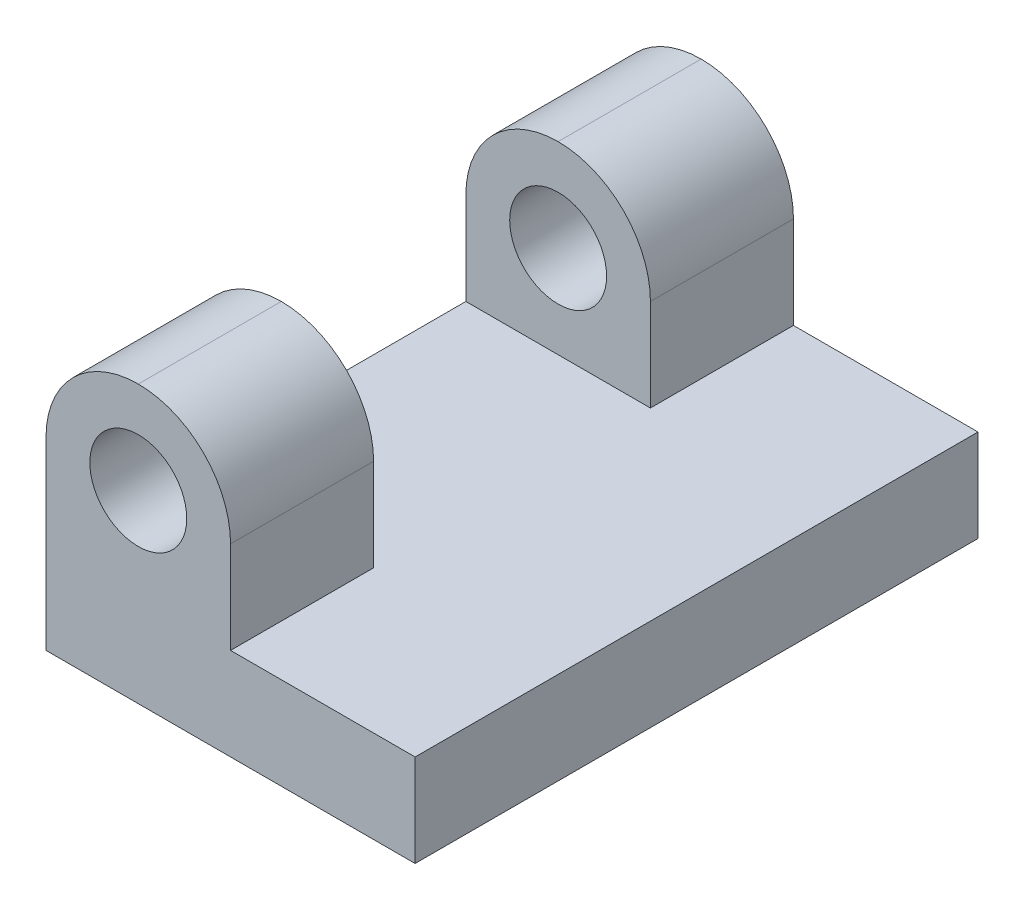
ISO-10303-21;
HEADER;
FILE_DESCRIPTION(('STEP AP214'),'2;1');
FILE_NAME('part.step','',(''),(''),'','','');
FILE_SCHEMA(('AUTOMOTIVE_DESIGN { 1 0 10303 214 1 1 1 1 }'));
ENDSEC;
DATA;
#1=APPLICATION_CONTEXT('core data for automotive mechanical design processes');
#2=APPLICATION_PROTOCOL_DEFINITION('international standard','automotive_design',2000,#1);
#3=PRODUCT_CONTEXT('',#1,'mechanical');
#4=PRODUCT('Part','Part','',(#3));
#5=PRODUCT_RELATED_PRODUCT_CATEGORY('part','',(#4));
#6=PRODUCT_DEFINITION_FORMATION('','',#4);
#7=PRODUCT_DEFINITION_CONTEXT('part definition',#1,'design');
#8=PRODUCT_DEFINITION('design','',#6,#7);
#9=PRODUCT_DEFINITION_SHAPE('','',#8);
#10=(LENGTH_UNIT() NAMED_UNIT(*) SI_UNIT(.MILLI.,.METRE.));
#11=(NAMED_UNIT(*) PLANE_ANGLE_UNIT() SI_UNIT($,.RADIAN.));
#12=(NAMED_UNIT(*) SI_UNIT($,.STERADIAN.) SOLID_ANGLE_UNIT());
#13=UNCERTAINTY_MEASURE_WITH_UNIT(LENGTH_MEASURE(1.E-05),#10,'distance_accuracy_value','');
#14=(GEOMETRIC_REPRESENTATION_CONTEXT(3) GLOBAL_UNCERTAINTY_ASSIGNED_CONTEXT((#13)) GLOBAL_UNIT_ASSIGNED_CONTEXT((#10,
#11,#12)) REPRESENTATION_CONTEXT('',''));
#15=CARTESIAN_POINT('',(0.,0.,0.));
#16=DIRECTION('',(0.,0.,1.));
#17=DIRECTION('',(1.,0.,0.));
#18=AXIS2_PLACEMENT_3D('',#15,#16,#17);
#19=CARTESIAN_POINT('',(0.,9.,-9.15));
#20=DIRECTION('',(-1.,0.,0.));
#21=DIRECTION('',(0.,0.,1.));
#22=AXIS2_PLACEMENT_3D('',#19,#20,#21);
#23=PLANE('',#22);
#24=DIRECTION('',(0.,1.,0.));
#25=VECTOR('',#24,1.);
#26=CARTESIAN_POINT('',(0.,-7.81665382639197,4.5));
#27=LINE('',#26,#25);
#28=CARTESIAN_POINT('',(0.,3.,4.5));
#29=VERTEX_POINT('',#28);
#30=CARTESIAN_POINT('',(0.,6.,4.5));
#31=VERTEX_POINT('',#30);
#32=EDGE_CURVE('E130',#29,#31,#27,.T.);
#33=ORIENTED_EDGE('',*,*,#32,.T.);
#34=DIRECTION('',(0.,0.,-1.));
#35=VECTOR('',#34,1.);
#36=CARTESIAN_POINT('',(0.,6.,9.15));
#37=LINE('',#36,#35);
#38=CARTESIAN_POINT('',(0.,6.,9.15));
#39=VERTEX_POINT('',#38);
#40=EDGE_CURVE('E242',#31,#39,#37,.F.);
#41=ORIENTED_EDGE('',*,*,#40,.T.);
#42=DIRECTION('',(0.,-1.,0.));
#43=VECTOR('',#42,1.);
#44=CARTESIAN_POINT('',(0.,9.,9.15));
#45=LINE('',#44,#43);
#46=CARTESIAN_POINT('',(0.,3.,9.15));
#47=VERTEX_POINT('',#46);
#48=EDGE_CURVE('E158',#39,#47,#45,.T.);
#49=ORIENTED_EDGE('',*,*,#48,.T.);
#50=DIRECTION('',(0.,0.,-1.));
#51=VECTOR('',#50,1.);
#52=CARTESIAN_POINT('',(0.,3.,-9.15));
#53=LINE('',#52,#51);
#54=EDGE_CURVE('E148',#47,#29,#53,.T.);
#55=ORIENTED_EDGE('',*,*,#54,.T.);
#56=EDGE_LOOP('',(#33,#41,#49,#55));
#57=FACE_BOUND('',#56,.T.);
#58=ADVANCED_FACE('F43',(#57),#23,.F.);
#59=CARTESIAN_POINT('',(-3.,6.,-9.15));
#60=DIRECTION('',(0.,0.,1.));
#61=DIRECTION('',(1.,0.,0.));
#62=AXIS2_PLACEMENT_3D('',#59,#60,#61);
#63=CYLINDRICAL_SURFACE('',#62,1.575);
#64=CARTESIAN_POINT('',(-3.,6.,4.5));
#65=DIRECTION('',(0.,0.,1.));
#66=DIRECTION('',(1.,0.,0.));
#67=AXIS2_PLACEMENT_3D('',#64,#65,#66);
#68=CIRCLE('',#67,1.575);
#69=CARTESIAN_POINT('',(-1.425,6.,4.5));
#70=VERTEX_POINT('',#69);
#71=EDGE_CURVE('E219',#70,#70,#68,.F.);
#72=ORIENTED_EDGE('',*,*,#71,.T.);
#73=EDGE_LOOP('',(#72));
#74=FACE_BOUND('',#73,.T.);
#75=CARTESIAN_POINT('',(-3.,6.,9.15));
#76=DIRECTION('',(0.,0.,1.));
#77=DIRECTION('',(1.,0.,0.));
#78=AXIS2_PLACEMENT_3D('',#75,#76,#77);
#79=CIRCLE('',#78,1.575);
#80=CARTESIAN_POINT('',(-1.425,6.,9.15));
#81=VERTEX_POINT('',#80);
#82=EDGE_CURVE('E169',#81,#81,#79,.T.);
#83=ORIENTED_EDGE('',*,*,#82,.T.);
#84=EDGE_LOOP('',(#83));
#85=FACE_BOUND('',#84,.T.);
#86=ADVANCED_FACE('F294',(#74,#85),#63,.F.);
#87=CARTESIAN_POINT('',(0.,3.,0.));
#88=DIRECTION('',(0.,-1.,0.));
#89=DIRECTION('',(0.,0.,-1.));
#90=AXIS2_PLACEMENT_3D('',#87,#88,#89);
#91=PLANE('',#90);
#92=ORIENTED_EDGE('',*,*,#54,.F.);
#93=DIRECTION('',(1.,0.,0.));
#94=VECTOR('',#93,1.);
#95=CARTESIAN_POINT('',(-6.,3.,9.15));
#96=LINE('',#95,#94);
#97=CARTESIAN_POINT('',(6.,3.,9.15));
#98=VERTEX_POINT('',#97);
#99=EDGE_CURVE('E184',#47,#98,#96,.T.);
#100=ORIENTED_EDGE('',*,*,#99,.T.);
#101=DIRECTION('',(0.,0.,-1.));
#102=VECTOR('',#101,1.);
#103=CARTESIAN_POINT('',(6.,3.,9.15));
#104=LINE('',#103,#102);
#105=CARTESIAN_POINT('',(6.,3.,-9.15));
#106=VERTEX_POINT('',#105);
#107=EDGE_CURVE('E175',#98,#106,#104,.T.);
#108=ORIENTED_EDGE('',*,*,#107,.T.);
#109=DIRECTION('',(-1.,0.,0.));
#110=VECTOR('',#109,1.);
#111=CARTESIAN_POINT('',(-6.,3.,-9.15));
#112=LINE('',#111,#110);
#113=CARTESIAN_POINT('',(0.,3.,-9.15));
#114=VERTEX_POINT('',#113);
#115=EDGE_CURVE('E179',#106,#114,#112,.T.);
#116=ORIENTED_EDGE('',*,*,#115,.T.);
#117=CARTESIAN_POINT('',(0.,3.,-4.5));
#118=VERTEX_POINT('',#117);
#119=EDGE_CURVE('E161',#118,#114,#53,.T.);
#120=ORIENTED_EDGE('',*,*,#119,.F.);
#121=DIRECTION('',(-1.,0.,0.));
#122=VECTOR('',#121,1.);
#123=CARTESIAN_POINT('',(-6.,3.,-4.5));
#124=LINE('',#123,#122);
#125=CARTESIAN_POINT('',(-6.,3.,-4.5));
#126=VERTEX_POINT('',#125);
#127=EDGE_CURVE('E277',#118,#126,#124,.T.);
#128=ORIENTED_EDGE('',*,*,#127,.T.);
#129=DIRECTION('',(0.,0.,1.));
#130=VECTOR('',#129,1.);
#131=CARTESIAN_POINT('',(-6.,3.,-4.5));
#132=LINE('',#131,#130);
#133=CARTESIAN_POINT('',(-6.,3.,4.5));
#134=VERTEX_POINT('',#133);
#135=EDGE_CURVE('E152',#126,#134,#132,.T.);
#136=ORIENTED_EDGE('',*,*,#135,.T.);
#137=DIRECTION('',(1.,0.,0.));
#138=VECTOR('',#137,1.);
#139=CARTESIAN_POINT('',(-6.,3.,4.5));
#140=LINE('',#139,#138);
#141=EDGE_CURVE('E135',#134,#29,#140,.T.);
#142=ORIENTED_EDGE('',*,*,#141,.T.);
#143=EDGE_LOOP('',(#92,#100,#108,#116,#120,#128,#136,#142));
#144=FACE_BOUND('',#143,.T.);
#145=ADVANCED_FACE('F147',(#144),#91,.F.);
#146=CARTESIAN_POINT('',(6.,3.,9.15));
#147=DIRECTION('',(-1.,0.,0.));
#148=DIRECTION('',(0.,0.,1.));
#149=AXIS2_PLACEMENT_3D('',#146,#147,#148);
#150=PLANE('',#149);
#151=DIRECTION('',(0.,0.,-1.));
#152=VECTOR('',#151,1.);
#153=CARTESIAN_POINT('',(6.,0.,9.15));
#154=LINE('',#153,#152);
#155=CARTESIAN_POINT('',(6.,0.,9.15));
#156=VERTEX_POINT('',#155);
#157=CARTESIAN_POINT('',(6.,0.,-9.15));
#158=VERTEX_POINT('',#157);
#159=EDGE_CURVE('E174',#156,#158,#154,.T.);
#160=ORIENTED_EDGE('',*,*,#159,.T.);
#161=DIRECTION('',(0.,-1.,0.));
#162=VECTOR('',#161,1.);
#163=CARTESIAN_POINT('',(6.,3.,-9.15));
#164=LINE('',#163,#162);
#165=EDGE_CURVE('E210',#106,#158,#164,.T.);
#166=ORIENTED_EDGE('',*,*,#165,.F.);
#167=ORIENTED_EDGE('',*,*,#107,.F.);
#168=DIRECTION('',(0.,-1.,0.));
#169=VECTOR('',#168,1.);
#170=CARTESIAN_POINT('',(6.,3.,9.15));
#171=LINE('',#170,#169);
#172=EDGE_CURVE('E187',#98,#156,#171,.T.);
#173=ORIENTED_EDGE('',*,*,#172,.T.);
#174=EDGE_LOOP('',(#160,#166,#167,#173));
#175=FACE_BOUND('',#174,.T.);
#176=ADVANCED_FACE('F316',(#175),#150,.F.);
#177=CARTESIAN_POINT('',(-6.,3.,-9.15));
#178=DIRECTION('',(0.,0.,1.));
#179=DIRECTION('',(1.,0.,0.));
#180=AXIS2_PLACEMENT_3D('',#177,#178,#179);
#181=PLANE('',#180);
#182=CARTESIAN_POINT('',(-3.,6.,-9.15));
#183=DIRECTION('',(0.,0.,1.));
#184=DIRECTION('',(1.,0.,0.));
#185=AXIS2_PLACEMENT_3D('',#182,#183,#184);
#186=CIRCLE('',#185,1.575);
#187=CARTESIAN_POINT('',(-1.425,6.,-9.15));
#188=VERTEX_POINT('',#187);
#189=EDGE_CURVE('E167',#188,#188,#186,.T.);
#190=ORIENTED_EDGE('',*,*,#189,.T.);
#191=EDGE_LOOP('',(#190));
#192=FACE_BOUND('',#191,.T.);
#193=DIRECTION('',(0.,-1.,0.));
#194=VECTOR('',#193,1.);
#195=CARTESIAN_POINT('',(-6.,3.,-9.15));
#196=LINE('',#195,#194);
#197=CARTESIAN_POINT('',(-6.,6.,-9.15));
#198=VERTEX_POINT('',#197);
#199=CARTESIAN_POINT('',(-6.,0.,-9.15));
#200=VERTEX_POINT('',#199);
#201=EDGE_CURVE('E207',#198,#200,#196,.T.);
#202=ORIENTED_EDGE('',*,*,#201,.F.);
#203=CARTESIAN_POINT('',(-3.,6.,-9.15));
#204=DIRECTION('',(0.,0.,1.));
#205=DIRECTION('',(1.,0.,0.));
#206=AXIS2_PLACEMENT_3D('',#203,#204,#205);
#207=CIRCLE('',#206,3.);
#208=CARTESIAN_POINT('',(-3.,9.,-9.15));
#209=VERTEX_POINT('',#208);
#210=EDGE_CURVE('E53',#198,#209,#207,.F.);
#211=ORIENTED_EDGE('',*,*,#210,.T.);
#212=CARTESIAN_POINT('',(-3.,6.,-9.15));
#213=DIRECTION('',(0.,0.,1.));
#214=DIRECTION('',(1.,0.,0.));
#215=AXIS2_PLACEMENT_3D('',#212,#213,#214);
#216=CIRCLE('',#215,3.);
#217=CARTESIAN_POINT('',(0.,6.,-9.15));
#218=VERTEX_POINT('',#217);
#219=EDGE_CURVE('E61',#209,#218,#216,.F.);
#220=ORIENTED_EDGE('',*,*,#219,.T.);
#221=DIRECTION('',(0.,-1.,0.));
#222=VECTOR('',#221,1.);
#223=CARTESIAN_POINT('',(0.,9.,-9.15));
#224=LINE('',#223,#222);
#225=EDGE_CURVE('E160',#218,#114,#224,.T.);
#226=ORIENTED_EDGE('',*,*,#225,.T.);
#227=ORIENTED_EDGE('',*,*,#115,.F.);
#228=ORIENTED_EDGE('',*,*,#165,.T.);
#229=DIRECTION('',(-1.,0.,0.));
#230=VECTOR('',#229,1.);
#231=CARTESIAN_POINT('',(-6.,0.,-9.15));
#232=LINE('',#231,#230);
#233=EDGE_CURVE('E191',#158,#200,#232,.T.);
#234=ORIENTED_EDGE('',*,*,#233,.T.);
#235=EDGE_LOOP('',(#202,#211,#220,#226,#227,#228,#234));
#236=FACE_BOUND('',#235,.T.);
#237=ADVANCED_FACE('F318',(#192,#236),#181,.F.);
#238=CARTESIAN_POINT('',(-6.,3.,9.15));
#239=DIRECTION('',(1.,0.,0.));
#240=DIRECTION('',(0.,0.,-1.));
#241=AXIS2_PLACEMENT_3D('',#238,#239,#240);
#242=PLANE('',#241);
#243=DIRECTION('',(0.,-1.,0.));
#244=VECTOR('',#243,1.);
#245=CARTESIAN_POINT('',(-6.,3.,9.15));
#246=LINE('',#245,#244);
#247=CARTESIAN_POINT('',(-6.,6.,9.15));
#248=VERTEX_POINT('',#247);
#249=CARTESIAN_POINT('',(-6.,0.,9.15));
#250=VERTEX_POINT('',#249);
#251=EDGE_CURVE('E204',#248,#250,#246,.T.);
#252=ORIENTED_EDGE('',*,*,#251,.F.);
#253=DIRECTION('',(0.,0.,1.));
#254=VECTOR('',#253,1.);
#255=CARTESIAN_POINT('',(-6.,6.,4.5));
#256=LINE('',#255,#254);
#257=CARTESIAN_POINT('',(-6.,6.,4.5));
#258=VERTEX_POINT('',#257);
#259=EDGE_CURVE('E233',#248,#258,#256,.F.);
#260=ORIENTED_EDGE('',*,*,#259,.T.);
#261=DIRECTION('',(0.,1.,0.));
#262=VECTOR('',#261,1.);
#263=CARTESIAN_POINT('',(-6.,-7.81665382639197,4.5));
#264=LINE('',#263,#262);
#265=EDGE_CURVE('E220',#134,#258,#264,.T.);
#266=ORIENTED_EDGE('',*,*,#265,.F.);
#267=ORIENTED_EDGE('',*,*,#135,.F.);
#268=DIRECTION('',(0.,1.,0.));
#269=VECTOR('',#268,1.);
#270=CARTESIAN_POINT('',(-6.,-7.81665382639197,-4.5));
#271=LINE('',#270,#269);
#272=CARTESIAN_POINT('',(-6.,6.,-4.5));
#273=VERTEX_POINT('',#272);
#274=EDGE_CURVE('E281',#126,#273,#271,.T.);
#275=ORIENTED_EDGE('',*,*,#274,.T.);
#276=DIRECTION('',(0.,0.,1.));
#277=VECTOR('',#276,1.);
#278=CARTESIAN_POINT('',(-6.,6.,-9.15));
#279=LINE('',#278,#277);
#280=EDGE_CURVE('E229',#273,#198,#279,.F.);
#281=ORIENTED_EDGE('',*,*,#280,.T.);
#282=ORIENTED_EDGE('',*,*,#201,.T.);
#283=DIRECTION('',(0.,0.,1.));
#284=VECTOR('',#283,1.);
#285=CARTESIAN_POINT('',(-6.,0.,9.15));
#286=LINE('',#285,#284);
#287=EDGE_CURVE('E195',#200,#250,#286,.T.);
#288=ORIENTED_EDGE('',*,*,#287,.T.);
#289=EDGE_LOOP('',(#252,#260,#266,#267,#275,#281,#282,#288));
#290=FACE_BOUND('',#289,.T.);
#291=ADVANCED_FACE('F300',(#290),#242,.F.);
#292=CARTESIAN_POINT('',(-6.,3.,9.15));
#293=DIRECTION('',(0.,0.,-1.));
#294=DIRECTION('',(-1.,0.,0.));
#295=AXIS2_PLACEMENT_3D('',#292,#293,#294);
#296=PLANE('',#295);
#297=ORIENTED_EDGE('',*,*,#82,.F.);
#298=EDGE_LOOP('',(#297));
#299=FACE_BOUND('',#298,.T.);
#300=CARTESIAN_POINT('',(-3.,6.,9.15));
#301=DIRECTION('',(0.,0.,-1.));
#302=DIRECTION('',(-1.,0.,0.));
#303=AXIS2_PLACEMENT_3D('',#300,#301,#302);
#304=CIRCLE('',#303,3.);
#305=CARTESIAN_POINT('',(-3.,9.,9.15));
#306=VERTEX_POINT('',#305);
#307=EDGE_CURVE('E214',#39,#306,#304,.F.);
#308=ORIENTED_EDGE('',*,*,#307,.T.);
#309=CARTESIAN_POINT('',(-3.,6.,9.15));
#310=DIRECTION('',(0.,0.,-1.));
#311=DIRECTION('',(-1.,0.,0.));
#312=AXIS2_PLACEMENT_3D('',#309,#310,#311);
#313=CIRCLE('',#312,3.);
#314=EDGE_CURVE('E226',#306,#248,#313,.F.);
#315=ORIENTED_EDGE('',*,*,#314,.T.);
#316=ORIENTED_EDGE('',*,*,#251,.T.);
#317=DIRECTION('',(1.,0.,0.));
#318=VECTOR('',#317,1.);
#319=CARTESIAN_POINT('',(-6.,0.,9.15));
#320=LINE('',#319,#318);
#321=EDGE_CURVE('E180',#250,#156,#320,.T.);
#322=ORIENTED_EDGE('',*,*,#321,.T.);
#323=ORIENTED_EDGE('',*,*,#172,.F.);
#324=ORIENTED_EDGE('',*,*,#99,.F.);
#325=ORIENTED_EDGE('',*,*,#48,.F.);
#326=EDGE_LOOP('',(#308,#315,#316,#322,#323,#324,#325));
#327=FACE_BOUND('',#326,.T.);
#328=ADVANCED_FACE('F296',(#299,#327),#296,.F.);
#329=CARTESIAN_POINT('',(0.,0.,0.));
#330=DIRECTION('',(0.,-1.,0.));
#331=DIRECTION('',(0.,0.,-1.));
#332=AXIS2_PLACEMENT_3D('',#329,#330,#331);
#333=PLANE('',#332);
#334=ORIENTED_EDGE('',*,*,#159,.F.);
#335=ORIENTED_EDGE('',*,*,#321,.F.);
#336=ORIENTED_EDGE('',*,*,#287,.F.);
#337=ORIENTED_EDGE('',*,*,#233,.F.);
#338=EDGE_LOOP('',(#334,#335,#336,#337));
#339=FACE_BOUND('',#338,.T.);
#340=ADVANCED_FACE('F299',(#339),#333,.T.);
#341=ORIENTED_EDGE('',*,*,#225,.F.);
#342=DIRECTION('',(0.,0.,-1.));
#343=VECTOR('',#342,1.);
#344=CARTESIAN_POINT('',(0.,6.,-4.5));
#345=LINE('',#344,#343);
#346=CARTESIAN_POINT('',(0.,6.,-4.5));
#347=VERTEX_POINT('',#346);
#348=EDGE_CURVE('E11',#218,#347,#345,.F.);
#349=ORIENTED_EDGE('',*,*,#348,.T.);
#350=DIRECTION('',(0.,1.,0.));
#351=VECTOR('',#350,1.);
#352=CARTESIAN_POINT('',(0.,-7.81665382639197,-4.5));
#353=LINE('',#352,#351);
#354=EDGE_CURVE('E143',#118,#347,#353,.T.);
#355=ORIENTED_EDGE('',*,*,#354,.F.);
#356=ORIENTED_EDGE('',*,*,#119,.T.);
#357=EDGE_LOOP('',(#341,#349,#355,#356));
#358=FACE_BOUND('',#357,.T.);
#359=ADVANCED_FACE('F272',(#358),#23,.F.);
#360=CARTESIAN_POINT('',(-3.,6.,-4.5));
#361=DIRECTION('',(0.,0.,-1.));
#362=DIRECTION('',(-1.,0.,0.));
#363=AXIS2_PLACEMENT_3D('',#360,#361,#362);
#364=CIRCLE('',#363,1.575);
#365=CARTESIAN_POINT('',(-4.575,6.,-4.5));
#366=VERTEX_POINT('',#365);
#367=EDGE_CURVE('E215',#366,#366,#364,.F.);
#368=ORIENTED_EDGE('',*,*,#367,.T.);
#369=EDGE_LOOP('',(#368));
#370=FACE_BOUND('',#369,.T.);
#371=ORIENTED_EDGE('',*,*,#189,.F.);
#372=EDGE_LOOP('',(#371));
#373=FACE_BOUND('',#372,.T.);
#374=ADVANCED_FACE('F338',(#370,#373),#63,.F.);
#375=CARTESIAN_POINT('',(-6.,-7.81665382639197,4.5));
#376=DIRECTION('',(0.,0.,1.));
#377=DIRECTION('',(1.,0.,0.));
#378=AXIS2_PLACEMENT_3D('',#375,#376,#377);
#379=PLANE('',#378);
#380=ORIENTED_EDGE('',*,*,#265,.T.);
#381=CARTESIAN_POINT('',(-3.,6.,4.5));
#382=DIRECTION('',(0.,0.,1.));
#383=DIRECTION('',(1.,0.,0.));
#384=AXIS2_PLACEMENT_3D('',#381,#382,#383);
#385=CIRCLE('',#384,3.);
#386=CARTESIAN_POINT('',(-3.,9.,4.5));
#387=VERTEX_POINT('',#386);
#388=EDGE_CURVE('E239',#258,#387,#385,.F.);
#389=ORIENTED_EDGE('',*,*,#388,.T.);
#390=CARTESIAN_POINT('',(-3.,6.,4.5));
#391=DIRECTION('',(0.,0.,1.));
#392=DIRECTION('',(1.,0.,0.));
#393=AXIS2_PLACEMENT_3D('',#390,#391,#392);
#394=CIRCLE('',#393,3.);
#395=EDGE_CURVE('E138',#387,#31,#394,.F.);
#396=ORIENTED_EDGE('',*,*,#395,.T.);
#397=ORIENTED_EDGE('',*,*,#32,.F.);
#398=ORIENTED_EDGE('',*,*,#141,.F.);
#399=EDGE_LOOP('',(#380,#389,#396,#397,#398));
#400=FACE_BOUND('',#399,.T.);
#401=ORIENTED_EDGE('',*,*,#71,.F.);
#402=EDGE_LOOP('',(#401));
#403=FACE_BOUND('',#402,.T.);
#404=ADVANCED_FACE('F133',(#400,#403),#379,.F.);
#405=CARTESIAN_POINT('',(-6.,-7.81665382639197,-4.5));
#406=DIRECTION('',(0.,0.,-1.));
#407=DIRECTION('',(-1.,0.,0.));
#408=AXIS2_PLACEMENT_3D('',#405,#406,#407);
#409=PLANE('',#408);
#410=CARTESIAN_POINT('',(-3.,6.,-4.5));
#411=DIRECTION('',(0.,0.,-1.));
#412=DIRECTION('',(-1.,0.,0.));
#413=AXIS2_PLACEMENT_3D('',#410,#411,#412);
#414=CIRCLE('',#413,3.);
#415=CARTESIAN_POINT('',(-3.,9.,-4.5));
#416=VERTEX_POINT('',#415);
#417=EDGE_CURVE('E245',#347,#416,#414,.F.);
#418=ORIENTED_EDGE('',*,*,#417,.T.);
#419=CARTESIAN_POINT('',(-3.,6.,-4.5));
#420=DIRECTION('',(0.,0.,-1.));
#421=DIRECTION('',(-1.,0.,0.));
#422=AXIS2_PLACEMENT_3D('',#419,#420,#421);
#423=CIRCLE('',#422,3.);
#424=EDGE_CURVE('E248',#416,#273,#423,.F.);
#425=ORIENTED_EDGE('',*,*,#424,.T.);
#426=ORIENTED_EDGE('',*,*,#274,.F.);
#427=ORIENTED_EDGE('',*,*,#127,.F.);
#428=ORIENTED_EDGE('',*,*,#354,.T.);
#429=EDGE_LOOP('',(#418,#425,#426,#427,#428));
#430=FACE_BOUND('',#429,.T.);
#431=ORIENTED_EDGE('',*,*,#367,.F.);
#432=EDGE_LOOP('',(#431));
#433=FACE_BOUND('',#432,.T.);
#434=ADVANCED_FACE('F275',(#430,#433),#409,.F.);
#435=CARTESIAN_POINT('',(-3.,6.,0.));
#436=DIRECTION('',(0.,0.,1.));
#437=DIRECTION('',(1.,0.,0.));
#438=AXIS2_PLACEMENT_3D('',#435,#436,#437);
#439=CYLINDRICAL_SURFACE('',#438,3.);
#440=ORIENTED_EDGE('',*,*,#40,.F.);
#441=ORIENTED_EDGE('',*,*,#395,.F.);
#442=DIRECTION('',(0.,0.,-1.));
#443=VECTOR('',#442,1.);
#444=CARTESIAN_POINT('',(-3.,9.,4.5));
#445=LINE('',#444,#443);
#446=EDGE_CURVE('E155',#306,#387,#445,.T.);
#447=ORIENTED_EDGE('',*,*,#446,.F.);
#448=ORIENTED_EDGE('',*,*,#307,.F.);
#449=EDGE_LOOP('',(#440,#441,#447,#448));
#450=FACE_BOUND('',#449,.T.);
#451=ADVANCED_FACE('F305',(#450),#439,.T.);
#452=CARTESIAN_POINT('',(-3.,6.,0.));
#453=DIRECTION('',(0.,0.,-1.));
#454=DIRECTION('',(-1.,0.,0.));
#455=AXIS2_PLACEMENT_3D('',#452,#453,#454);
#456=CYLINDRICAL_SURFACE('',#455,3.);
#457=ORIENTED_EDGE('',*,*,#388,.F.);
#458=ORIENTED_EDGE('',*,*,#259,.F.);
#459=ORIENTED_EDGE('',*,*,#314,.F.);
#460=ORIENTED_EDGE('',*,*,#446,.T.);
#461=EDGE_LOOP('',(#457,#458,#459,#460));
#462=FACE_BOUND('',#461,.T.);
#463=ADVANCED_FACE('F307',(#462),#456,.T.);
#464=CARTESIAN_POINT('',(-3.,6.,0.));
#465=DIRECTION('',(0.,0.,1.));
#466=DIRECTION('',(1.,0.,0.));
#467=AXIS2_PLACEMENT_3D('',#464,#465,#466);
#468=CYLINDRICAL_SURFACE('',#467,3.);
#469=ORIENTED_EDGE('',*,*,#348,.F.);
#470=ORIENTED_EDGE('',*,*,#219,.F.);
#471=DIRECTION('',(0.,0.,-1.));
#472=VECTOR('',#471,1.);
#473=CARTESIAN_POINT('',(-3.,9.,-9.15));
#474=LINE('',#473,#472);
#475=EDGE_CURVE('E47',#416,#209,#474,.T.);
#476=ORIENTED_EDGE('',*,*,#475,.F.);
#477=ORIENTED_EDGE('',*,*,#417,.F.);
#478=EDGE_LOOP('',(#469,#470,#476,#477));
#479=FACE_BOUND('',#478,.T.);
#480=ADVANCED_FACE('F45',(#479),#468,.T.);
#481=CARTESIAN_POINT('',(-3.,6.,0.));
#482=DIRECTION('',(0.,0.,-1.));
#483=DIRECTION('',(-1.,0.,0.));
#484=AXIS2_PLACEMENT_3D('',#481,#482,#483);
#485=CYLINDRICAL_SURFACE('',#484,3.);
#486=ORIENTED_EDGE('',*,*,#210,.F.);
#487=ORIENTED_EDGE('',*,*,#280,.F.);
#488=ORIENTED_EDGE('',*,*,#424,.F.);
#489=ORIENTED_EDGE('',*,*,#475,.T.);
#490=EDGE_LOOP('',(#486,#487,#488,#489));
#491=FACE_BOUND('',#490,.T.);
#492=ADVANCED_FACE('F264',(#491),#485,.T.);
#493=CLOSED_SHELL('',(#58,#86,#145,#176,#237,#291,#328,#340,#359,#374,#404,#434,#451,#463,#480,#492));
#494=MANIFOLD_SOLID_BREP('B2',#493);
#495=ADVANCED_BREP_SHAPE_REPRESENTATION('',(#18,#494),#14);
#496=SHAPE_DEFINITION_REPRESENTATION(#9,#495);
ENDSEC;
END-ISO-10303-21;
